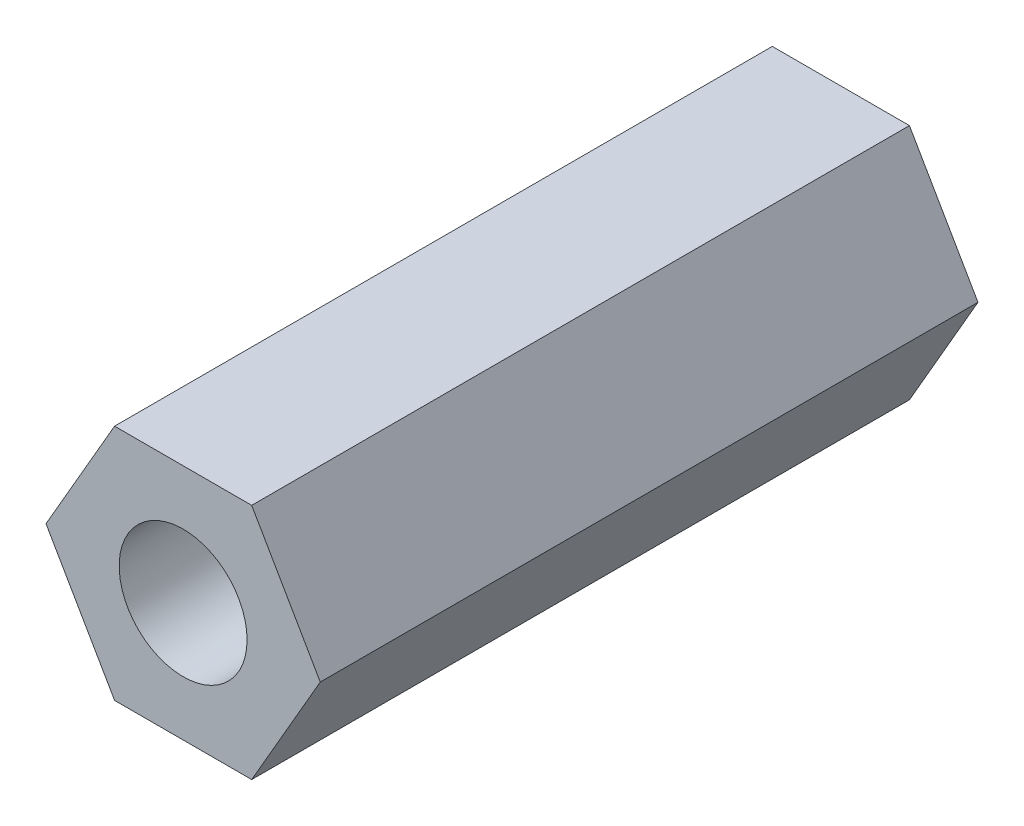
ISO-10303-21;
HEADER;
FILE_DESCRIPTION(('STEP AP214'),'2;1');
FILE_NAME('part.step','',(''),(''),'','','');
FILE_SCHEMA(('AUTOMOTIVE_DESIGN { 1 0 10303 214 1 1 1 1 }'));
ENDSEC;
DATA;
#1=APPLICATION_CONTEXT('core data for automotive mechanical design processes');
#2=APPLICATION_PROTOCOL_DEFINITION('international standard','automotive_design',2000,#1);
#3=PRODUCT_CONTEXT('',#1,'mechanical');
#4=PRODUCT('Part','Part','',(#3));
#5=PRODUCT_RELATED_PRODUCT_CATEGORY('part','',(#4));
#6=PRODUCT_DEFINITION_FORMATION('','',#4);
#7=PRODUCT_DEFINITION_CONTEXT('part definition',#1,'design');
#8=PRODUCT_DEFINITION('design','',#6,#7);
#9=PRODUCT_DEFINITION_SHAPE('','',#8);
#10=(LENGTH_UNIT() NAMED_UNIT(*) SI_UNIT(.MILLI.,.METRE.));
#11=(NAMED_UNIT(*) PLANE_ANGLE_UNIT() SI_UNIT($,.RADIAN.));
#12=(NAMED_UNIT(*) SI_UNIT($,.STERADIAN.) SOLID_ANGLE_UNIT());
#13=UNCERTAINTY_MEASURE_WITH_UNIT(LENGTH_MEASURE(1.E-05),#10,'distance_accuracy_value','');
#14=(GEOMETRIC_REPRESENTATION_CONTEXT(3) GLOBAL_UNCERTAINTY_ASSIGNED_CONTEXT((#13)) GLOBAL_UNIT_ASSIGNED_CONTEXT((#10,
#11,#12)) REPRESENTATION_CONTEXT('',''));
#15=CARTESIAN_POINT('',(0.,0.,0.));
#16=DIRECTION('',(0.,0.,1.));
#17=DIRECTION('',(1.,0.,0.));
#18=AXIS2_PLACEMENT_3D('',#15,#16,#17);
#19=CARTESIAN_POINT('',(0.,0.,18.));
#20=DIRECTION('',(0.,0.,1.));
#21=DIRECTION('',(1.,0.,0.));
#22=AXIS2_PLACEMENT_3D('',#19,#20,#21);
#23=PLANE('',#22);
#24=DIRECTION('',(0.5,0.866025403784439,0.));
#25=VECTOR('',#24,1.);
#26=CARTESIAN_POINT('',(1.87638837486628,-3.25,18.));
#27=LINE('',#26,#25);
#28=CARTESIAN_POINT('',(1.87638837486628,-3.25,18.));
#29=VERTEX_POINT('',#28);
#30=CARTESIAN_POINT('',(3.75277674973257,0.,18.));
#31=VERTEX_POINT('',#30);
#32=EDGE_CURVE('E132',#29,#31,#27,.T.);
#33=ORIENTED_EDGE('',*,*,#32,.T.);
#34=DIRECTION('',(-0.5,0.866025403784438,0.));
#35=VECTOR('',#34,1.);
#36=CARTESIAN_POINT('',(3.75277674973257,0.,18.));
#37=LINE('',#36,#35);
#38=CARTESIAN_POINT('',(1.87638837486628,3.25,18.));
#39=VERTEX_POINT('',#38);
#40=EDGE_CURVE('E90',#31,#39,#37,.T.);
#41=ORIENTED_EDGE('',*,*,#40,.T.);
#42=DIRECTION('',(-1.,0.,0.));
#43=VECTOR('',#42,1.);
#44=CARTESIAN_POINT('',(1.87638837486628,3.25,18.));
#45=LINE('',#44,#43);
#46=CARTESIAN_POINT('',(-1.87638837486628,3.25,18.));
#47=VERTEX_POINT('',#46);
#48=EDGE_CURVE('E103',#39,#47,#45,.T.);
#49=ORIENTED_EDGE('',*,*,#48,.T.);
#50=DIRECTION('',(-0.5,-0.866025403784439,0.));
#51=VECTOR('',#50,1.);
#52=CARTESIAN_POINT('',(-1.87638837486628,3.25,18.));
#53=LINE('',#52,#51);
#54=CARTESIAN_POINT('',(-3.75277674973257,0.,18.));
#55=VERTEX_POINT('',#54);
#56=EDGE_CURVE('E97',#47,#55,#53,.T.);
#57=ORIENTED_EDGE('',*,*,#56,.T.);
#58=DIRECTION('',(0.5,-0.866025403784438,0.));
#59=VECTOR('',#58,1.);
#60=CARTESIAN_POINT('',(-3.75277674973257,0.,18.));
#61=LINE('',#60,#59);
#62=CARTESIAN_POINT('',(-1.87638837486628,-3.25,18.));
#63=VERTEX_POINT('',#62);
#64=EDGE_CURVE('E101',#55,#63,#61,.T.);
#65=ORIENTED_EDGE('',*,*,#64,.T.);
#66=DIRECTION('',(1.,0.,0.));
#67=VECTOR('',#66,1.);
#68=CARTESIAN_POINT('',(-1.87638837486628,-3.25,18.));
#69=LINE('',#68,#67);
#70=EDGE_CURVE('E53',#63,#29,#69,.T.);
#71=ORIENTED_EDGE('',*,*,#70,.T.);
#72=EDGE_LOOP('',(#33,#41,#49,#57,#65,#71));
#73=FACE_BOUND('',#72,.T.);
#74=CARTESIAN_POINT('',(0.,0.,18.));
#75=DIRECTION('',(0.,0.,1.));
#76=DIRECTION('',(1.,0.,0.));
#77=AXIS2_PLACEMENT_3D('',#74,#75,#76);
#78=CIRCLE('',#77,1.75);
#79=CARTESIAN_POINT('',(1.75,0.,18.));
#80=VERTEX_POINT('',#79);
#81=EDGE_CURVE('E125',#80,#80,#78,.T.);
#82=ORIENTED_EDGE('',*,*,#81,.F.);
#83=EDGE_LOOP('',(#82));
#84=FACE_BOUND('',#83,.T.);
#85=ADVANCED_FACE('F36',(#73,#84),#23,.T.);
#86=CARTESIAN_POINT('',(0.,0.,0.));
#87=DIRECTION('',(0.,0.,1.));
#88=DIRECTION('',(1.,0.,0.));
#89=AXIS2_PLACEMENT_3D('',#86,#87,#88);
#90=PLANE('',#89);
#91=DIRECTION('',(0.5,0.866025403784439,0.));
#92=VECTOR('',#91,1.);
#93=CARTESIAN_POINT('',(1.87638837486628,-3.25,0.));
#94=LINE('',#93,#92);
#95=CARTESIAN_POINT('',(1.87638837486628,-3.25,0.));
#96=VERTEX_POINT('',#95);
#97=CARTESIAN_POINT('',(3.75277674973257,0.,0.));
#98=VERTEX_POINT('',#97);
#99=EDGE_CURVE('E121',#96,#98,#94,.T.);
#100=ORIENTED_EDGE('',*,*,#99,.F.);
#101=DIRECTION('',(1.,0.,0.));
#102=VECTOR('',#101,1.);
#103=CARTESIAN_POINT('',(-1.87638837486628,-3.25,0.));
#104=LINE('',#103,#102);
#105=CARTESIAN_POINT('',(-1.87638837486628,-3.25,0.));
#106=VERTEX_POINT('',#105);
#107=EDGE_CURVE('E82',#106,#96,#104,.T.);
#108=ORIENTED_EDGE('',*,*,#107,.F.);
#109=DIRECTION('',(0.5,-0.866025403784438,0.));
#110=VECTOR('',#109,1.);
#111=CARTESIAN_POINT('',(-3.75277674973257,0.,0.));
#112=LINE('',#111,#110);
#113=CARTESIAN_POINT('',(-3.75277674973257,0.,0.));
#114=VERTEX_POINT('',#113);
#115=EDGE_CURVE('E76',#114,#106,#112,.T.);
#116=ORIENTED_EDGE('',*,*,#115,.F.);
#117=DIRECTION('',(-0.5,-0.866025403784439,0.));
#118=VECTOR('',#117,1.);
#119=CARTESIAN_POINT('',(-1.87638837486628,3.25,0.));
#120=LINE('',#119,#118);
#121=CARTESIAN_POINT('',(-1.87638837486628,3.25,0.));
#122=VERTEX_POINT('',#121);
#123=EDGE_CURVE('E111',#122,#114,#120,.T.);
#124=ORIENTED_EDGE('',*,*,#123,.F.);
#125=DIRECTION('',(-1.,0.,0.));
#126=VECTOR('',#125,1.);
#127=CARTESIAN_POINT('',(1.87638837486628,3.25,0.));
#128=LINE('',#127,#126);
#129=CARTESIAN_POINT('',(1.87638837486628,3.25,0.));
#130=VERTEX_POINT('',#129);
#131=EDGE_CURVE('E127',#130,#122,#128,.T.);
#132=ORIENTED_EDGE('',*,*,#131,.F.);
#133=DIRECTION('',(-0.5,0.866025403784438,0.));
#134=VECTOR('',#133,1.);
#135=CARTESIAN_POINT('',(3.75277674973257,0.,0.));
#136=LINE('',#135,#134);
#137=EDGE_CURVE('E124',#98,#130,#136,.T.);
#138=ORIENTED_EDGE('',*,*,#137,.F.);
#139=EDGE_LOOP('',(#100,#108,#116,#124,#132,#138));
#140=FACE_BOUND('',#139,.T.);
#141=CARTESIAN_POINT('',(0.,0.,0.));
#142=DIRECTION('',(0.,0.,1.));
#143=DIRECTION('',(1.,0.,0.));
#144=AXIS2_PLACEMENT_3D('',#141,#142,#143);
#145=CIRCLE('',#144,1.75);
#146=CARTESIAN_POINT('',(1.75,0.,0.));
#147=VERTEX_POINT('',#146);
#148=EDGE_CURVE('E225',#147,#147,#145,.T.);
#149=ORIENTED_EDGE('',*,*,#148,.T.);
#150=EDGE_LOOP('',(#149));
#151=FACE_BOUND('',#150,.T.);
#152=ADVANCED_FACE('F141',(#140,#151),#90,.F.);
#153=CARTESIAN_POINT('',(1.87638837486628,-3.25,18.));
#154=DIRECTION('',(-0.866025403784439,0.5,0.));
#155=DIRECTION('',(-0.5,-0.866025403784439,0.));
#156=AXIS2_PLACEMENT_3D('',#153,#154,#155);
#157=PLANE('',#156);
#158=ORIENTED_EDGE('',*,*,#99,.T.);
#159=DIRECTION('',(0.,0.,-1.));
#160=VECTOR('',#159,1.);
#161=CARTESIAN_POINT('',(3.75277674973257,0.,18.));
#162=LINE('',#161,#160);
#163=EDGE_CURVE('E11',#31,#98,#162,.T.);
#164=ORIENTED_EDGE('',*,*,#163,.F.);
#165=ORIENTED_EDGE('',*,*,#32,.F.);
#166=DIRECTION('',(0.,0.,-1.));
#167=VECTOR('',#166,1.);
#168=CARTESIAN_POINT('',(1.87638837486628,-3.25,18.));
#169=LINE('',#168,#167);
#170=EDGE_CURVE('E117',#29,#96,#169,.T.);
#171=ORIENTED_EDGE('',*,*,#170,.T.);
#172=EDGE_LOOP('',(#158,#164,#165,#171));
#173=FACE_BOUND('',#172,.T.);
#174=ADVANCED_FACE('F38',(#173),#157,.F.);
#175=CARTESIAN_POINT('',(3.75277674973257,0.,18.));
#176=DIRECTION('',(-0.866025403784439,-0.5,0.));
#177=DIRECTION('',(0.5,-0.866025403784439,0.));
#178=AXIS2_PLACEMENT_3D('',#175,#176,#177);
#179=PLANE('',#178);
#180=ORIENTED_EDGE('',*,*,#137,.T.);
#181=DIRECTION('',(0.,0.,-1.));
#182=VECTOR('',#181,1.);
#183=CARTESIAN_POINT('',(1.87638837486628,3.25,18.));
#184=LINE('',#183,#182);
#185=EDGE_CURVE('E45',#39,#130,#184,.T.);
#186=ORIENTED_EDGE('',*,*,#185,.F.);
#187=ORIENTED_EDGE('',*,*,#40,.F.);
#188=ORIENTED_EDGE('',*,*,#163,.T.);
#189=EDGE_LOOP('',(#180,#186,#187,#188));
#190=FACE_BOUND('',#189,.T.);
#191=ADVANCED_FACE('F166',(#190),#179,.F.);
#192=CARTESIAN_POINT('',(1.87638837486628,3.25,18.));
#193=DIRECTION('',(0.,-1.,0.));
#194=DIRECTION('',(0.,0.,-1.));
#195=AXIS2_PLACEMENT_3D('',#192,#193,#194);
#196=PLANE('',#195);
#197=ORIENTED_EDGE('',*,*,#131,.T.);
#198=DIRECTION('',(0.,0.,-1.));
#199=VECTOR('',#198,1.);
#200=CARTESIAN_POINT('',(-1.87638837486628,3.25,18.));
#201=LINE('',#200,#199);
#202=EDGE_CURVE('E112',#47,#122,#201,.T.);
#203=ORIENTED_EDGE('',*,*,#202,.F.);
#204=ORIENTED_EDGE('',*,*,#48,.F.);
#205=ORIENTED_EDGE('',*,*,#185,.T.);
#206=EDGE_LOOP('',(#197,#203,#204,#205));
#207=FACE_BOUND('',#206,.T.);
#208=ADVANCED_FACE('F138',(#207),#196,.F.);
#209=CARTESIAN_POINT('',(-1.87638837486628,3.25,18.));
#210=DIRECTION('',(0.866025403784439,-0.5,0.));
#211=DIRECTION('',(0.5,0.866025403784439,0.));
#212=AXIS2_PLACEMENT_3D('',#209,#210,#211);
#213=PLANE('',#212);
#214=ORIENTED_EDGE('',*,*,#123,.T.);
#215=DIRECTION('',(0.,0.,-1.));
#216=VECTOR('',#215,1.);
#217=CARTESIAN_POINT('',(-3.75277674973257,0.,18.));
#218=LINE('',#217,#216);
#219=EDGE_CURVE('E108',#55,#114,#218,.T.);
#220=ORIENTED_EDGE('',*,*,#219,.F.);
#221=ORIENTED_EDGE('',*,*,#56,.F.);
#222=ORIENTED_EDGE('',*,*,#202,.T.);
#223=EDGE_LOOP('',(#214,#220,#221,#222));
#224=FACE_BOUND('',#223,.T.);
#225=ADVANCED_FACE('F109',(#224),#213,.F.);
#226=CARTESIAN_POINT('',(-3.75277674973257,0.,18.));
#227=DIRECTION('',(0.866025403784438,0.5,0.));
#228=DIRECTION('',(-0.5,0.866025403784439,0.));
#229=AXIS2_PLACEMENT_3D('',#226,#227,#228);
#230=PLANE('',#229);
#231=ORIENTED_EDGE('',*,*,#115,.T.);
#232=DIRECTION('',(0.,0.,-1.));
#233=VECTOR('',#232,1.);
#234=CARTESIAN_POINT('',(-1.87638837486628,-3.25,18.));
#235=LINE('',#234,#233);
#236=EDGE_CURVE('E113',#63,#106,#235,.T.);
#237=ORIENTED_EDGE('',*,*,#236,.F.);
#238=ORIENTED_EDGE('',*,*,#64,.F.);
#239=ORIENTED_EDGE('',*,*,#219,.T.);
#240=EDGE_LOOP('',(#231,#237,#238,#239));
#241=FACE_BOUND('',#240,.T.);
#242=ADVANCED_FACE('F115',(#241),#230,.F.);
#243=CARTESIAN_POINT('',(-1.87638837486628,-3.25,18.));
#244=DIRECTION('',(0.,1.,0.));
#245=DIRECTION('',(-1.,0.,0.));
#246=AXIS2_PLACEMENT_3D('',#243,#244,#245);
#247=PLANE('',#246);
#248=ORIENTED_EDGE('',*,*,#107,.T.);
#249=ORIENTED_EDGE('',*,*,#170,.F.);
#250=ORIENTED_EDGE('',*,*,#70,.F.);
#251=ORIENTED_EDGE('',*,*,#236,.T.);
#252=EDGE_LOOP('',(#248,#249,#250,#251));
#253=FACE_BOUND('',#252,.T.);
#254=ADVANCED_FACE('F146',(#253),#247,.F.);
#255=CARTESIAN_POINT('',(0.,0.,18.));
#256=DIRECTION('',(0.,0.,-1.));
#257=DIRECTION('',(-1.,0.,0.));
#258=AXIS2_PLACEMENT_3D('',#255,#256,#257);
#259=CYLINDRICAL_SURFACE('',#258,1.75);
#260=ORIENTED_EDGE('',*,*,#81,.T.);
#261=EDGE_LOOP('',(#260));
#262=FACE_BOUND('',#261,.T.);
#263=ORIENTED_EDGE('',*,*,#148,.F.);
#264=EDGE_LOOP('',(#263));
#265=FACE_BOUND('',#264,.T.);
#266=ADVANCED_FACE('F148',(#262,#265),#259,.F.);
#267=CLOSED_SHELL('',(#85,#152,#174,#191,#208,#225,#242,#254,#266));
#268=MANIFOLD_SOLID_BREP('B2',#267);
#269=ADVANCED_BREP_SHAPE_REPRESENTATION('',(#18,#268),#14);
#270=SHAPE_DEFINITION_REPRESENTATION(#9,#269);
ENDSEC;
END-ISO-10303-21;
